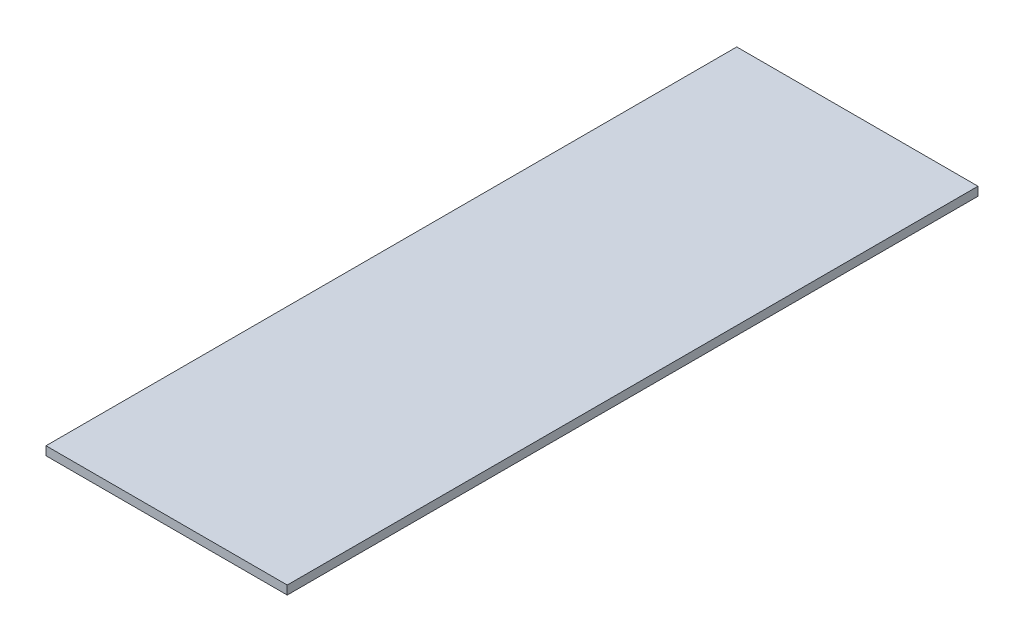
ISO-10303-21;
HEADER;
FILE_DESCRIPTION(('STEP AP214'),'2;1');
FILE_NAME('part.step','',(''),(''),'','','');
FILE_SCHEMA(('AUTOMOTIVE_DESIGN { 1 0 10303 214 1 1 1 1 }'));
ENDSEC;
DATA;
#1=APPLICATION_CONTEXT('core data for automotive mechanical design processes');
#2=APPLICATION_PROTOCOL_DEFINITION('international standard','automotive_design',2000,#1);
#3=PRODUCT_CONTEXT('',#1,'mechanical');
#4=PRODUCT('Part','Part','',(#3));
#5=PRODUCT_RELATED_PRODUCT_CATEGORY('part','',(#4));
#6=PRODUCT_DEFINITION_FORMATION('','',#4);
#7=PRODUCT_DEFINITION_CONTEXT('part definition',#1,'design');
#8=PRODUCT_DEFINITION('design','',#6,#7);
#9=PRODUCT_DEFINITION_SHAPE('','',#8);
#10=(LENGTH_UNIT() NAMED_UNIT(*) SI_UNIT(.MILLI.,.METRE.));
#11=(NAMED_UNIT(*) PLANE_ANGLE_UNIT() SI_UNIT($,.RADIAN.));
#12=(NAMED_UNIT(*) SI_UNIT($,.STERADIAN.) SOLID_ANGLE_UNIT());
#13=UNCERTAINTY_MEASURE_WITH_UNIT(LENGTH_MEASURE(1.E-05),#10,'distance_accuracy_value','');
#14=(GEOMETRIC_REPRESENTATION_CONTEXT(3) GLOBAL_UNCERTAINTY_ASSIGNED_CONTEXT((#13)) GLOBAL_UNIT_ASSIGNED_CONTEXT((#10,
#11,#12)) REPRESENTATION_CONTEXT('',''));
#15=CARTESIAN_POINT('',(0.,0.,0.));
#16=DIRECTION('',(0.,0.,1.));
#17=DIRECTION('',(1.,0.,0.));
#18=AXIS2_PLACEMENT_3D('',#15,#16,#17);
#19=CARTESIAN_POINT('',(-20.1279474015967,-5.85997935180166,118.));
#20=DIRECTION('',(1.,0.,0.));
#21=DIRECTION('',(0.,0.,-1.));
#22=AXIS2_PLACEMENT_3D('',#19,#20,#21);
#23=PLANE('',#22);
#24=DIRECTION('',(0.,-1.,0.));
#25=VECTOR('',#24,1.);
#26=CARTESIAN_POINT('',(-20.1279474015967,-5.85997935180166,0.));
#27=LINE('',#26,#25);
#28=CARTESIAN_POINT('',(-20.1279474015967,-5.85997935180166,0.));
#29=VERTEX_POINT('',#28);
#30=CARTESIAN_POINT('',(-20.1279474015967,-7.34676322260791,0.));
#31=VERTEX_POINT('',#30);
#32=EDGE_CURVE('E111',#29,#31,#27,.T.);
#33=ORIENTED_EDGE('',*,*,#32,.T.);
#34=DIRECTION('',(0.,0.,-1.));
#35=VECTOR('',#34,1.);
#36=CARTESIAN_POINT('',(-20.1279474015967,-7.34676322260791,118.));
#37=LINE('',#36,#35);
#38=CARTESIAN_POINT('',(-20.1279474015967,-7.34676322260791,118.));
#39=VERTEX_POINT('',#38);
#40=EDGE_CURVE('E11',#39,#31,#37,.T.);
#41=ORIENTED_EDGE('',*,*,#40,.F.);
#42=DIRECTION('',(0.,-1.,0.));
#43=VECTOR('',#42,1.);
#44=CARTESIAN_POINT('',(-20.1279474015967,-5.85997935180166,118.));
#45=LINE('',#44,#43);
#46=CARTESIAN_POINT('',(-20.1279474015967,-5.85997935180166,118.));
#47=VERTEX_POINT('',#46);
#48=EDGE_CURVE('E95',#47,#39,#45,.T.);
#49=ORIENTED_EDGE('',*,*,#48,.F.);
#50=DIRECTION('',(0.,0.,-1.));
#51=VECTOR('',#50,1.);
#52=CARTESIAN_POINT('',(-20.1279474015967,-5.85997935180166,118.));
#53=LINE('',#52,#51);
#54=EDGE_CURVE('E107',#47,#29,#53,.T.);
#55=ORIENTED_EDGE('',*,*,#54,.T.);
#56=EDGE_LOOP('',(#33,#41,#49,#55));
#57=FACE_BOUND('',#56,.T.);
#58=ADVANCED_FACE('F43',(#57),#23,.F.);
#59=CARTESIAN_POINT('',(-20.1279474015967,-7.34676322260791,118.));
#60=DIRECTION('',(0.,1.,0.));
#61=DIRECTION('',(0.,0.,1.));
#62=AXIS2_PLACEMENT_3D('',#59,#60,#61);
#63=PLANE('',#62);
#64=DIRECTION('',(1.,0.,0.));
#65=VECTOR('',#64,1.);
#66=CARTESIAN_POINT('',(-20.1279474015967,-7.34676322260791,0.));
#67=LINE('',#66,#65);
#68=CARTESIAN_POINT('',(21.0826516840842,-7.34676322260791,0.));
#69=VERTEX_POINT('',#68);
#70=EDGE_CURVE('E100',#31,#69,#67,.T.);
#71=ORIENTED_EDGE('',*,*,#70,.T.);
#72=DIRECTION('',(0.,0.,-1.));
#73=VECTOR('',#72,1.);
#74=CARTESIAN_POINT('',(21.0826516840842,-7.34676322260791,118.));
#75=LINE('',#74,#73);
#76=CARTESIAN_POINT('',(21.0826516840842,-7.34676322260791,118.));
#77=VERTEX_POINT('',#76);
#78=EDGE_CURVE('E52',#77,#69,#75,.T.);
#79=ORIENTED_EDGE('',*,*,#78,.F.);
#80=DIRECTION('',(1.,0.,0.));
#81=VECTOR('',#80,1.);
#82=CARTESIAN_POINT('',(-20.1279474015967,-7.34676322260791,118.));
#83=LINE('',#82,#81);
#84=EDGE_CURVE('E90',#39,#77,#83,.T.);
#85=ORIENTED_EDGE('',*,*,#84,.F.);
#86=ORIENTED_EDGE('',*,*,#40,.T.);
#87=EDGE_LOOP('',(#71,#79,#85,#86));
#88=FACE_BOUND('',#87,.T.);
#89=ADVANCED_FACE('F99',(#88),#63,.F.);
#90=CARTESIAN_POINT('',(21.0826516840842,-5.85997935180166,118.));
#91=DIRECTION('',(-1.,0.,0.));
#92=DIRECTION('',(0.,0.,1.));
#93=AXIS2_PLACEMENT_3D('',#90,#91,#92);
#94=PLANE('',#93);
#95=DIRECTION('',(0.,1.,0.));
#96=VECTOR('',#95,1.);
#97=CARTESIAN_POINT('',(21.0826516840842,-5.85997935180166,0.));
#98=LINE('',#97,#96);
#99=CARTESIAN_POINT('',(21.0826516840842,-5.85997935180166,0.));
#100=VERTEX_POINT('',#99);
#101=EDGE_CURVE('E77',#69,#100,#98,.T.);
#102=ORIENTED_EDGE('',*,*,#101,.T.);
#103=DIRECTION('',(0.,0.,-1.));
#104=VECTOR('',#103,1.);
#105=CARTESIAN_POINT('',(21.0826516840842,-5.85997935180166,118.));
#106=LINE('',#105,#104);
#107=CARTESIAN_POINT('',(21.0826516840842,-5.85997935180166,118.));
#108=VERTEX_POINT('',#107);
#109=EDGE_CURVE('E102',#108,#100,#106,.T.);
#110=ORIENTED_EDGE('',*,*,#109,.F.);
#111=DIRECTION('',(0.,1.,0.));
#112=VECTOR('',#111,1.);
#113=CARTESIAN_POINT('',(21.0826516840842,-5.85997935180166,118.));
#114=LINE('',#113,#112);
#115=EDGE_CURVE('E93',#77,#108,#114,.T.);
#116=ORIENTED_EDGE('',*,*,#115,.F.);
#117=ORIENTED_EDGE('',*,*,#78,.T.);
#118=EDGE_LOOP('',(#102,#110,#116,#117));
#119=FACE_BOUND('',#118,.T.);
#120=ADVANCED_FACE('F103',(#119),#94,.F.);
#121=CARTESIAN_POINT('',(-20.1279474015967,-5.85997935180166,118.));
#122=DIRECTION('',(0.,-1.,0.));
#123=DIRECTION('',(0.,0.,-1.));
#124=AXIS2_PLACEMENT_3D('',#121,#122,#123);
#125=PLANE('',#124);
#126=DIRECTION('',(-1.,0.,0.));
#127=VECTOR('',#126,1.);
#128=CARTESIAN_POINT('',(-20.1279474015967,-5.85997935180166,0.));
#129=LINE('',#128,#127);
#130=EDGE_CURVE('E83',#100,#29,#129,.T.);
#131=ORIENTED_EDGE('',*,*,#130,.T.);
#132=ORIENTED_EDGE('',*,*,#54,.F.);
#133=DIRECTION('',(-1.,0.,0.));
#134=VECTOR('',#133,1.);
#135=CARTESIAN_POINT('',(-20.1279474015967,-5.85997935180166,118.));
#136=LINE('',#135,#134);
#137=EDGE_CURVE('E60',#108,#47,#136,.T.);
#138=ORIENTED_EDGE('',*,*,#137,.F.);
#139=ORIENTED_EDGE('',*,*,#109,.T.);
#140=EDGE_LOOP('',(#131,#132,#138,#139));
#141=FACE_BOUND('',#140,.T.);
#142=ADVANCED_FACE('F124',(#141),#125,.F.);
#143=CARTESIAN_POINT('',(0.,0.,118.));
#144=DIRECTION('',(0.,0.,1.));
#145=DIRECTION('',(1.,0.,0.));
#146=AXIS2_PLACEMENT_3D('',#143,#144,#145);
#147=PLANE('',#146);
#148=ORIENTED_EDGE('',*,*,#48,.T.);
#149=ORIENTED_EDGE('',*,*,#84,.T.);
#150=ORIENTED_EDGE('',*,*,#115,.T.);
#151=ORIENTED_EDGE('',*,*,#137,.T.);
#152=EDGE_LOOP('',(#148,#149,#150,#151));
#153=FACE_BOUND('',#152,.T.);
#154=ADVANCED_FACE('F91',(#153),#147,.T.);
#155=CARTESIAN_POINT('',(0.,0.,0.));
#156=DIRECTION('',(0.,0.,1.));
#157=DIRECTION('',(1.,0.,0.));
#158=AXIS2_PLACEMENT_3D('',#155,#156,#157);
#159=PLANE('',#158);
#160=ORIENTED_EDGE('',*,*,#32,.F.);
#161=ORIENTED_EDGE('',*,*,#130,.F.);
#162=ORIENTED_EDGE('',*,*,#101,.F.);
#163=ORIENTED_EDGE('',*,*,#70,.F.);
#164=EDGE_LOOP('',(#160,#161,#162,#163));
#165=FACE_BOUND('',#164,.T.);
#166=ADVANCED_FACE('F127',(#165),#159,.F.);
#167=CLOSED_SHELL('',(#58,#89,#120,#142,#154,#166));
#168=MANIFOLD_SOLID_BREP('B2',#167);
#169=ADVANCED_BREP_SHAPE_REPRESENTATION('',(#18,#168),#14);
#170=SHAPE_DEFINITION_REPRESENTATION(#9,#169);
ENDSEC;
END-ISO-10303-21;
